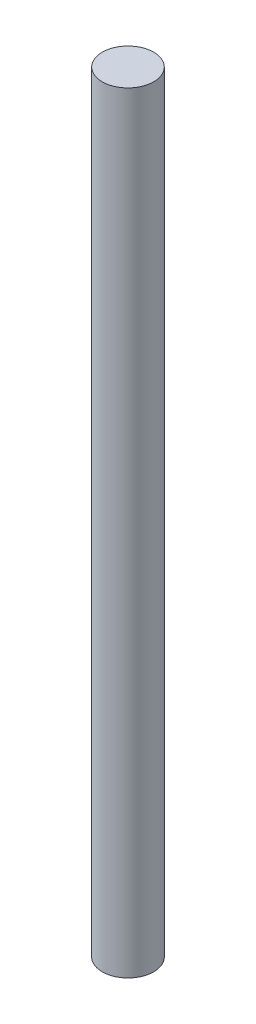
ISO-10303-21;
HEADER;
FILE_DESCRIPTION(('STEP AP214'),'2;1');
FILE_NAME('part.step','',(''),(''),'','','');
FILE_SCHEMA(('AUTOMOTIVE_DESIGN { 1 0 10303 214 1 1 1 1 }'));
ENDSEC;
DATA;
#1=APPLICATION_CONTEXT('core data for automotive mechanical design processes');
#2=APPLICATION_PROTOCOL_DEFINITION('international standard','automotive_design',2000,#1);
#3=PRODUCT_CONTEXT('',#1,'mechanical');
#4=PRODUCT('Part','Part','',(#3));
#5=PRODUCT_RELATED_PRODUCT_CATEGORY('part','',(#4));
#6=PRODUCT_DEFINITION_FORMATION('','',#4);
#7=PRODUCT_DEFINITION_CONTEXT('part definition',#1,'design');
#8=PRODUCT_DEFINITION('design','',#6,#7);
#9=PRODUCT_DEFINITION_SHAPE('','',#8);
#10=(LENGTH_UNIT() NAMED_UNIT(*) SI_UNIT(.MILLI.,.METRE.));
#11=(NAMED_UNIT(*) PLANE_ANGLE_UNIT() SI_UNIT($,.RADIAN.));
#12=(NAMED_UNIT(*) SI_UNIT($,.STERADIAN.) SOLID_ANGLE_UNIT());
#13=UNCERTAINTY_MEASURE_WITH_UNIT(LENGTH_MEASURE(1.E-05),#10,'distance_accuracy_value','');
#14=(GEOMETRIC_REPRESENTATION_CONTEXT(3) GLOBAL_UNCERTAINTY_ASSIGNED_CONTEXT((#13)) GLOBAL_UNIT_ASSIGNED_CONTEXT((#10,
#11,#12)) REPRESENTATION_CONTEXT('',''));
#15=CARTESIAN_POINT('',(0.,0.,0.));
#16=DIRECTION('',(0.,0.,1.));
#17=DIRECTION('',(1.,0.,0.));
#18=AXIS2_PLACEMENT_3D('',#15,#16,#17);
#19=CARTESIAN_POINT('',(0.,120.,0.));
#20=DIRECTION('',(0.,-1.,0.));
#21=DIRECTION('',(0.,0.,-1.));
#22=AXIS2_PLACEMENT_3D('',#19,#20,#21);
#23=CYLINDRICAL_SURFACE('',#22,4.);
#24=CARTESIAN_POINT('',(0.,120.,0.));
#25=DIRECTION('',(0.,1.,0.));
#26=DIRECTION('',(0.,0.,1.));
#27=AXIS2_PLACEMENT_3D('',#24,#25,#26);
#28=CIRCLE('',#27,4.);
#29=CARTESIAN_POINT('',(0.,120.,4.));
#30=VERTEX_POINT('',#29);
#31=EDGE_CURVE('E10',#30,#30,#28,.T.);
#32=ORIENTED_EDGE('',*,*,#31,.F.);
#33=EDGE_LOOP('',(#32));
#34=FACE_BOUND('',#33,.T.);
#35=CARTESIAN_POINT('',(0.,0.,0.));
#36=DIRECTION('',(0.,1.,0.));
#37=DIRECTION('',(0.,0.,1.));
#38=AXIS2_PLACEMENT_3D('',#35,#36,#37);
#39=CIRCLE('',#38,4.);
#40=CARTESIAN_POINT('',(0.,0.,4.));
#41=VERTEX_POINT('',#40);
#42=EDGE_CURVE('E34',#41,#41,#39,.T.);
#43=ORIENTED_EDGE('',*,*,#42,.T.);
#44=EDGE_LOOP('',(#43));
#45=FACE_BOUND('',#44,.T.);
#46=ADVANCED_FACE('F31',(#34,#45),#23,.T.);
#47=CARTESIAN_POINT('',(0.,120.,0.));
#48=DIRECTION('',(0.,1.,0.));
#49=DIRECTION('',(0.,0.,1.));
#50=AXIS2_PLACEMENT_3D('',#47,#48,#49);
#51=PLANE('',#50);
#52=ORIENTED_EDGE('',*,*,#31,.T.);
#53=EDGE_LOOP('',(#52));
#54=FACE_BOUND('',#53,.T.);
#55=ADVANCED_FACE('F46',(#54),#51,.T.);
#56=CARTESIAN_POINT('',(0.,0.,0.));
#57=DIRECTION('',(0.,1.,0.));
#58=DIRECTION('',(0.,0.,1.));
#59=AXIS2_PLACEMENT_3D('',#56,#57,#58);
#60=PLANE('',#59);
#61=ORIENTED_EDGE('',*,*,#42,.F.);
#62=EDGE_LOOP('',(#61));
#63=FACE_BOUND('',#62,.T.);
#64=ADVANCED_FACE('F44',(#63),#60,.F.);
#65=CLOSED_SHELL('',(#46,#55,#64));
#66=MANIFOLD_SOLID_BREP('B2',#65);
#67=ADVANCED_BREP_SHAPE_REPRESENTATION('',(#18,#66),#14);
#68=SHAPE_DEFINITION_REPRESENTATION(#9,#67);
ENDSEC;
END-ISO-10303-21;
